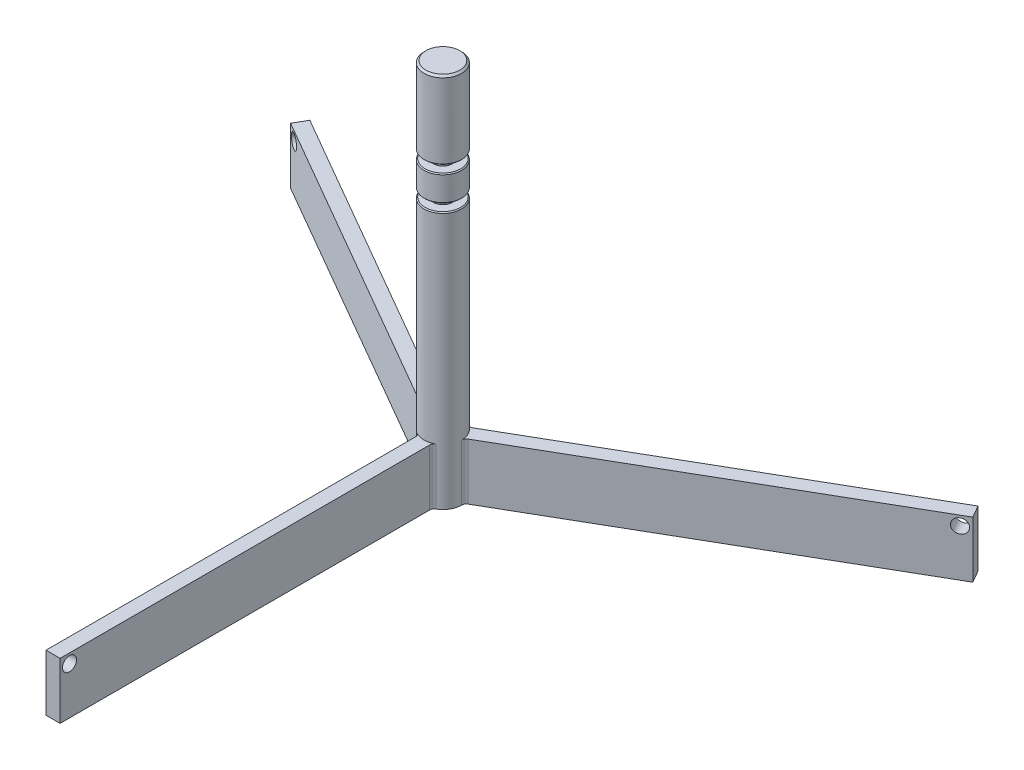
ISO-10303-21;
HEADER;
FILE_DESCRIPTION(('STEP AP214'),'2;1');
FILE_NAME('part.step','',(''),(''),'','','');
FILE_SCHEMA(('AUTOMOTIVE_DESIGN { 1 0 10303 214 1 1 1 1 }'));
ENDSEC;
DATA;
#1=APPLICATION_CONTEXT('core data for automotive mechanical design processes');
#2=APPLICATION_PROTOCOL_DEFINITION('international standard','automotive_design',2000,#1);
#3=PRODUCT_CONTEXT('',#1,'mechanical');
#4=PRODUCT('Part','Part','',(#3));
#5=PRODUCT_RELATED_PRODUCT_CATEGORY('part','',(#4));
#6=PRODUCT_DEFINITION_FORMATION('','',#4);
#7=PRODUCT_DEFINITION_CONTEXT('part definition',#1,'design');
#8=PRODUCT_DEFINITION('design','',#6,#7);
#9=PRODUCT_DEFINITION_SHAPE('','',#8);
#10=(LENGTH_UNIT() NAMED_UNIT(*) SI_UNIT(.MILLI.,.METRE.));
#11=(NAMED_UNIT(*) PLANE_ANGLE_UNIT() SI_UNIT($,.RADIAN.));
#12=(NAMED_UNIT(*) SI_UNIT($,.STERADIAN.) SOLID_ANGLE_UNIT());
#13=UNCERTAINTY_MEASURE_WITH_UNIT(LENGTH_MEASURE(1.E-05),#10,'distance_accuracy_value','');
#14=(GEOMETRIC_REPRESENTATION_CONTEXT(3) GLOBAL_UNCERTAINTY_ASSIGNED_CONTEXT((#13)) GLOBAL_UNIT_ASSIGNED_CONTEXT((#10,
#11,#12)) REPRESENTATION_CONTEXT('',''));
#15=CARTESIAN_POINT('',(0.,0.,0.));
#16=DIRECTION('',(0.,0.,1.));
#17=DIRECTION('',(1.,0.,0.));
#18=AXIS2_PLACEMENT_3D('',#15,#16,#17);
#19=CARTESIAN_POINT('',(0.,112.38552238806,0.));
#20=DIRECTION('',(0.,1.,0.));
#21=DIRECTION('',(0.,0.,1.));
#22=AXIS2_PLACEMENT_3D('',#19,#20,#21);
#23=CYLINDRICAL_SURFACE('',#22,12.7);
#24=CARTESIAN_POINT('',(0.,173.355,0.));
#25=DIRECTION('',(0.,-1.,0.));
#26=DIRECTION('',(0.,0.,-1.));
#27=AXIS2_PLACEMENT_3D('',#24,#25,#26);
#28=CIRCLE('',#27,12.7);
#29=CARTESIAN_POINT('',(0.,173.355,-12.7));
#30=VERTEX_POINT('',#29);
#31=EDGE_CURVE('E322',#30,#30,#28,.T.);
#32=ORIENTED_EDGE('',*,*,#31,.T.);
#33=EDGE_LOOP('',(#32));
#34=FACE_BOUND('',#33,.T.);
#35=CARTESIAN_POINT('',(0.,38.1,0.));
#36=DIRECTION('',(0.,-1.,0.));
#37=DIRECTION('',(0.,0.,-1.));
#38=AXIS2_PLACEMENT_3D('',#35,#36,#37);
#39=CIRCLE('',#38,12.7);
#40=CARTESIAN_POINT('',(6.35000000000009,38.1,-10.9985226280623));
#41=VERTEX_POINT('',#40);
#42=CARTESIAN_POINT('',(12.7,38.1,1.17961196366423E-13));
#43=VERTEX_POINT('',#42);
#44=EDGE_CURVE('E279',#41,#43,#39,.T.);
#45=ORIENTED_EDGE('',*,*,#44,.F.);
#46=DIRECTION('',(0.,1.,0.));
#47=VECTOR('',#46,1.);
#48=CARTESIAN_POINT('',(6.35000000000009,112.38552238806,-10.9985226280623));
#49=LINE('',#48,#47);
#50=CARTESIAN_POINT('',(6.35000000000009,0.,-10.9985226280623));
#51=VERTEX_POINT('',#50);
#52=EDGE_CURVE('E309',#41,#51,#49,.F.);
#53=ORIENTED_EDGE('',*,*,#52,.T.);
#54=CARTESIAN_POINT('',(0.,0.,0.));
#55=DIRECTION('',(0.,1.,0.));
#56=DIRECTION('',(0.,0.,1.));
#57=AXIS2_PLACEMENT_3D('',#54,#55,#56);
#58=CIRCLE('',#57,12.7);
#59=CARTESIAN_POINT('',(-6.34999999999994,0.,-10.9985226280624));
#60=VERTEX_POINT('',#59);
#61=EDGE_CURVE('E244',#51,#60,#58,.T.);
#62=ORIENTED_EDGE('',*,*,#61,.T.);
#63=DIRECTION('',(0.,1.,0.));
#64=VECTOR('',#63,1.);
#65=CARTESIAN_POINT('',(-6.34999999999994,112.38552238806,-10.9985226280624));
#66=LINE('',#65,#64);
#67=CARTESIAN_POINT('',(-6.34999999999994,38.1,-10.9985226280624));
#68=VERTEX_POINT('',#67);
#69=EDGE_CURVE('E285',#60,#68,#66,.T.);
#70=ORIENTED_EDGE('',*,*,#69,.T.);
#71=CARTESIAN_POINT('',(-12.7,38.1,0.));
#72=VERTEX_POINT('',#71);
#73=EDGE_CURVE('E281',#72,#68,#39,.T.);
#74=ORIENTED_EDGE('',*,*,#73,.F.);
#75=DIRECTION('',(0.,1.,0.));
#76=VECTOR('',#75,1.);
#77=CARTESIAN_POINT('',(-12.7,112.38552238806,0.));
#78=LINE('',#77,#76);
#79=CARTESIAN_POINT('',(-12.7,0.,0.));
#80=VERTEX_POINT('',#79);
#81=EDGE_CURVE('E288',#72,#80,#78,.F.);
#82=ORIENTED_EDGE('',*,*,#81,.T.);
#83=CARTESIAN_POINT('',(-6.35,0.,10.9985226280624));
#84=VERTEX_POINT('',#83);
#85=EDGE_CURVE('E239',#80,#84,#58,.T.);
#86=ORIENTED_EDGE('',*,*,#85,.T.);
#87=DIRECTION('',(0.,1.,0.));
#88=VECTOR('',#87,1.);
#89=CARTESIAN_POINT('',(-6.35,112.38552238806,10.9985226280624));
#90=LINE('',#89,#88);
#91=CARTESIAN_POINT('',(-6.35,38.1,10.9985226280624));
#92=VERTEX_POINT('',#91);
#93=EDGE_CURVE('E261',#84,#92,#90,.T.);
#94=ORIENTED_EDGE('',*,*,#93,.T.);
#95=CARTESIAN_POINT('',(0.,38.1,0.));
#96=DIRECTION('',(0.,-1.,0.));
#97=DIRECTION('',(0.,0.,-1.));
#98=AXIS2_PLACEMENT_3D('',#95,#96,#97);
#99=CIRCLE('',#98,12.7);
#100=CARTESIAN_POINT('',(6.35,38.1,10.9985226280624));
#101=VERTEX_POINT('',#100);
#102=EDGE_CURVE('E256',#101,#92,#99,.T.);
#103=ORIENTED_EDGE('',*,*,#102,.F.);
#104=DIRECTION('',(0.,1.,0.));
#105=VECTOR('',#104,1.);
#106=CARTESIAN_POINT('',(6.35,112.38552238806,10.9985226280624));
#107=LINE('',#106,#105);
#108=CARTESIAN_POINT('',(6.35,0.,10.9985226280624));
#109=VERTEX_POINT('',#108);
#110=EDGE_CURVE('E264',#101,#109,#107,.F.);
#111=ORIENTED_EDGE('',*,*,#110,.T.);
#112=CARTESIAN_POINT('',(12.7,0.,1.17961196366423E-13));
#113=VERTEX_POINT('',#112);
#114=EDGE_CURVE('E240',#109,#113,#58,.T.);
#115=ORIENTED_EDGE('',*,*,#114,.T.);
#116=DIRECTION('',(0.,1.,0.));
#117=VECTOR('',#116,1.);
#118=CARTESIAN_POINT('',(12.7,112.38552238806,1.17961196366423E-13));
#119=LINE('',#118,#117);
#120=EDGE_CURVE('E306',#113,#43,#119,.T.);
#121=ORIENTED_EDGE('',*,*,#120,.T.);
#122=EDGE_LOOP('',(#45,#53,#62,#70,#74,#82,#86,#94,#103,#111,#115,#121));
#123=FACE_BOUND('',#122,.T.);
#124=ADVANCED_FACE('F37',(#34,#123),#23,.T.);
#125=CARTESIAN_POINT('',(0.,254.,0.));
#126=DIRECTION('',(0.,-1.,0.));
#127=DIRECTION('',(0.,0.,-1.));
#128=AXIS2_PLACEMENT_3D('',#125,#126,#127);
#129=PLANE('',#128);
#130=CARTESIAN_POINT('',(0.,254.,0.));
#131=DIRECTION('',(0.,-1.,0.));
#132=DIRECTION('',(0.,0.,-1.));
#133=AXIS2_PLACEMENT_3D('',#130,#131,#132);
#134=CIRCLE('',#133,11.43);
#135=CARTESIAN_POINT('',(0.,254.,-11.43));
#136=VERTEX_POINT('',#135);
#137=EDGE_CURVE('E45',#136,#136,#134,.F.);
#138=ORIENTED_EDGE('',*,*,#137,.T.);
#139=EDGE_LOOP('',(#138));
#140=FACE_BOUND('',#139,.T.);
#141=ADVANCED_FACE('F345',(#140),#129,.F.);
#142=CARTESIAN_POINT('',(0.,112.38552238806,0.));
#143=DIRECTION('',(0.,1.,0.));
#144=DIRECTION('',(0.,0.,1.));
#145=AXIS2_PLACEMENT_3D('',#142,#143,#144);
#146=CYLINDRICAL_SURFACE('',#145,12.7);
#147=CARTESIAN_POINT('',(0.,252.73,0.));
#148=DIRECTION('',(0.,-1.,0.));
#149=DIRECTION('',(0.,0.,-1.));
#150=AXIS2_PLACEMENT_3D('',#147,#148,#149);
#151=CIRCLE('',#150,12.7);
#152=CARTESIAN_POINT('',(0.,252.73,-12.7));
#153=VERTEX_POINT('',#152);
#154=EDGE_CURVE('E11',#153,#153,#151,.T.);
#155=ORIENTED_EDGE('',*,*,#154,.T.);
#156=EDGE_LOOP('',(#155));
#157=FACE_BOUND('',#156,.T.);
#158=CARTESIAN_POINT('',(0.,202.311,0.));
#159=DIRECTION('',(0.,1.,0.));
#160=DIRECTION('',(0.,0.,1.));
#161=AXIS2_PLACEMENT_3D('',#158,#159,#160);
#162=CIRCLE('',#161,12.7);
#163=CARTESIAN_POINT('',(0.,202.311,12.7));
#164=VERTEX_POINT('',#163);
#165=EDGE_CURVE('E337',#164,#164,#162,.T.);
#166=ORIENTED_EDGE('',*,*,#165,.T.);
#167=EDGE_LOOP('',(#166));
#168=FACE_BOUND('',#167,.T.);
#169=ADVANCED_FACE('F362',(#157,#168),#146,.T.);
#170=CARTESIAN_POINT('',(6.35,201.676,0.));
#171=DIRECTION('',(0.,1.,0.));
#172=DIRECTION('',(0.,0.,1.));
#173=AXIS2_PLACEMENT_3D('',#170,#171,#172);
#174=PLANE('',#173);
#175=CARTESIAN_POINT('',(0.,201.676,0.));
#176=DIRECTION('',(0.,1.,0.));
#177=DIRECTION('',(0.,0.,1.));
#178=AXIS2_PLACEMENT_3D('',#175,#176,#177);
#179=CIRCLE('',#178,12.065);
#180=CARTESIAN_POINT('',(0.,201.676,12.065));
#181=VERTEX_POINT('',#180);
#182=EDGE_CURVE('E340',#181,#181,#179,.F.);
#183=ORIENTED_EDGE('',*,*,#182,.T.);
#184=EDGE_LOOP('',(#183));
#185=FACE_BOUND('',#184,.T.);
#186=CARTESIAN_POINT('',(0.,201.676,0.));
#187=DIRECTION('',(0.,1.,0.));
#188=DIRECTION('',(0.,0.,1.));
#189=AXIS2_PLACEMENT_3D('',#186,#187,#188);
#190=CIRCLE('',#189,6.35);
#191=CARTESIAN_POINT('',(0.,201.676,6.35));
#192=VERTEX_POINT('',#191);
#193=EDGE_CURVE('E253',#192,#192,#190,.T.);
#194=ORIENTED_EDGE('',*,*,#193,.T.);
#195=EDGE_LOOP('',(#194));
#196=FACE_BOUND('',#195,.T.);
#197=ADVANCED_FACE('F391',(#185,#196),#174,.F.);
#198=CARTESIAN_POINT('',(0.,112.38552238806,0.));
#199=DIRECTION('',(0.,1.,0.));
#200=DIRECTION('',(0.,0.,1.));
#201=AXIS2_PLACEMENT_3D('',#198,#199,#200);
#202=CYLINDRICAL_SURFACE('',#201,6.35);
#203=ORIENTED_EDGE('',*,*,#193,.F.);
#204=EDGE_LOOP('',(#203));
#205=FACE_BOUND('',#204,.T.);
#206=CARTESIAN_POINT('',(0.,196.596,0.));
#207=DIRECTION('',(0.,1.,0.));
#208=DIRECTION('',(0.,0.,1.));
#209=AXIS2_PLACEMENT_3D('',#206,#207,#208);
#210=CIRCLE('',#209,6.35);
#211=CARTESIAN_POINT('',(0.,196.596,6.35));
#212=VERTEX_POINT('',#211);
#213=EDGE_CURVE('E250',#212,#212,#210,.T.);
#214=ORIENTED_EDGE('',*,*,#213,.T.);
#215=EDGE_LOOP('',(#214));
#216=FACE_BOUND('',#215,.T.);
#217=ADVANCED_FACE('F387',(#205,#216),#202,.T.);
#218=CARTESIAN_POINT('',(12.7,196.596,0.));
#219=DIRECTION('',(0.,-1.,0.));
#220=DIRECTION('',(0.,0.,-1.));
#221=AXIS2_PLACEMENT_3D('',#218,#219,#220);
#222=PLANE('',#221);
#223=CARTESIAN_POINT('',(0.,196.596,0.));
#224=DIRECTION('',(0.,-1.,0.));
#225=DIRECTION('',(0.,0.,-1.));
#226=AXIS2_PLACEMENT_3D('',#223,#224,#225);
#227=CIRCLE('',#226,12.065);
#228=CARTESIAN_POINT('',(0.,196.596,-12.065));
#229=VERTEX_POINT('',#228);
#230=EDGE_CURVE('E334',#229,#229,#227,.F.);
#231=ORIENTED_EDGE('',*,*,#230,.T.);
#232=EDGE_LOOP('',(#231));
#233=FACE_BOUND('',#232,.T.);
#234=ORIENTED_EDGE('',*,*,#213,.F.);
#235=EDGE_LOOP('',(#234));
#236=FACE_BOUND('',#235,.T.);
#237=ADVANCED_FACE('F383',(#233,#236),#222,.F.);
#238=CARTESIAN_POINT('',(0.,112.38552238806,0.));
#239=DIRECTION('',(0.,1.,0.));
#240=DIRECTION('',(0.,0.,1.));
#241=AXIS2_PLACEMENT_3D('',#238,#239,#240);
#242=CYLINDRICAL_SURFACE('',#241,12.7);
#243=CARTESIAN_POINT('',(0.,179.705,0.));
#244=DIRECTION('',(0.,1.,0.));
#245=DIRECTION('',(0.,0.,1.));
#246=AXIS2_PLACEMENT_3D('',#243,#244,#245);
#247=CIRCLE('',#246,12.7);
#248=CARTESIAN_POINT('',(0.,179.705,12.7));
#249=VERTEX_POINT('',#248);
#250=EDGE_CURVE('E328',#249,#249,#247,.T.);
#251=ORIENTED_EDGE('',*,*,#250,.T.);
#252=EDGE_LOOP('',(#251));
#253=FACE_BOUND('',#252,.T.);
#254=CARTESIAN_POINT('',(0.,195.961,0.));
#255=DIRECTION('',(0.,-1.,0.));
#256=DIRECTION('',(0.,0.,-1.));
#257=AXIS2_PLACEMENT_3D('',#254,#255,#256);
#258=CIRCLE('',#257,12.7);
#259=CARTESIAN_POINT('',(0.,195.961,-12.7));
#260=VERTEX_POINT('',#259);
#261=EDGE_CURVE('E325',#260,#260,#258,.T.);
#262=ORIENTED_EDGE('',*,*,#261,.T.);
#263=EDGE_LOOP('',(#262));
#264=FACE_BOUND('',#263,.T.);
#265=ADVANCED_FACE('F379',(#253,#264),#242,.T.);
#266=CARTESIAN_POINT('',(6.35,179.07,0.));
#267=DIRECTION('',(0.,1.,0.));
#268=DIRECTION('',(0.,0.,1.));
#269=AXIS2_PLACEMENT_3D('',#266,#267,#268);
#270=PLANE('',#269);
#271=CARTESIAN_POINT('',(0.,179.07,0.));
#272=DIRECTION('',(0.,1.,0.));
#273=DIRECTION('',(0.,0.,1.));
#274=AXIS2_PLACEMENT_3D('',#271,#272,#273);
#275=CIRCLE('',#274,12.065);
#276=CARTESIAN_POINT('',(0.,179.07,12.065));
#277=VERTEX_POINT('',#276);
#278=EDGE_CURVE('E331',#277,#277,#275,.F.);
#279=ORIENTED_EDGE('',*,*,#278,.T.);
#280=EDGE_LOOP('',(#279));
#281=FACE_BOUND('',#280,.T.);
#282=CARTESIAN_POINT('',(0.,179.07,0.));
#283=DIRECTION('',(0.,1.,0.));
#284=DIRECTION('',(0.,0.,1.));
#285=AXIS2_PLACEMENT_3D('',#282,#283,#284);
#286=CIRCLE('',#285,6.35);
#287=CARTESIAN_POINT('',(0.,179.07,6.35));
#288=VERTEX_POINT('',#287);
#289=EDGE_CURVE('E247',#288,#288,#286,.T.);
#290=ORIENTED_EDGE('',*,*,#289,.T.);
#291=EDGE_LOOP('',(#290));
#292=FACE_BOUND('',#291,.T.);
#293=ADVANCED_FACE('F375',(#281,#292),#270,.F.);
#294=CARTESIAN_POINT('',(0.,112.38552238806,0.));
#295=DIRECTION('',(0.,1.,0.));
#296=DIRECTION('',(0.,0.,1.));
#297=AXIS2_PLACEMENT_3D('',#294,#295,#296);
#298=CYLINDRICAL_SURFACE('',#297,6.35);
#299=ORIENTED_EDGE('',*,*,#289,.F.);
#300=EDGE_LOOP('',(#299));
#301=FACE_BOUND('',#300,.T.);
#302=CARTESIAN_POINT('',(0.,173.99,0.));
#303=DIRECTION('',(0.,1.,0.));
#304=DIRECTION('',(0.,0.,1.));
#305=AXIS2_PLACEMENT_3D('',#302,#303,#304);
#306=CIRCLE('',#305,6.35);
#307=CARTESIAN_POINT('',(0.,173.99,6.35));
#308=VERTEX_POINT('',#307);
#309=EDGE_CURVE('E243',#308,#308,#306,.T.);
#310=ORIENTED_EDGE('',*,*,#309,.T.);
#311=EDGE_LOOP('',(#310));
#312=FACE_BOUND('',#311,.T.);
#313=ADVANCED_FACE('F371',(#301,#312),#298,.T.);
#314=CARTESIAN_POINT('',(12.7,173.99,0.));
#315=DIRECTION('',(0.,-1.,0.));
#316=DIRECTION('',(0.,0.,-1.));
#317=AXIS2_PLACEMENT_3D('',#314,#315,#316);
#318=PLANE('',#317);
#319=CARTESIAN_POINT('',(0.,173.99,0.));
#320=DIRECTION('',(0.,-1.,0.));
#321=DIRECTION('',(0.,0.,-1.));
#322=AXIS2_PLACEMENT_3D('',#319,#320,#321);
#323=CIRCLE('',#322,12.065);
#324=CARTESIAN_POINT('',(0.,173.99,-12.065));
#325=VERTEX_POINT('',#324);
#326=EDGE_CURVE('E319',#325,#325,#323,.F.);
#327=ORIENTED_EDGE('',*,*,#326,.T.);
#328=EDGE_LOOP('',(#327));
#329=FACE_BOUND('',#328,.T.);
#330=ORIENTED_EDGE('',*,*,#309,.F.);
#331=EDGE_LOOP('',(#330));
#332=FACE_BOUND('',#331,.T.);
#333=ADVANCED_FACE('F368',(#329,#332),#318,.F.);
#334=CARTESIAN_POINT('',(0.,0.,0.));
#335=DIRECTION('',(0.,1.,0.));
#336=DIRECTION('',(0.,0.,1.));
#337=AXIS2_PLACEMENT_3D('',#334,#335,#336);
#338=PLANE('',#337);
#339=ORIENTED_EDGE('',*,*,#85,.F.);
#340=CARTESIAN_POINT('',(-15.875,0.,0.));
#341=DIRECTION('',(0.,1.,0.));
#342=DIRECTION('',(0.,0.,1.));
#343=AXIS2_PLACEMENT_3D('',#340,#341,#342);
#344=CIRCLE('',#343,3.175);
#345=CARTESIAN_POINT('',(-14.2875,0.,-2.74963065701563));
#346=VERTEX_POINT('',#345);
#347=EDGE_CURVE('E296',#80,#346,#344,.T.);
#348=ORIENTED_EDGE('',*,*,#347,.T.);
#349=DIRECTION('',(0.866025403784436,0.,0.500000000000004));
#350=VECTOR('',#349,1.);
#351=CARTESIAN_POINT('',(-230.600594532294,0.,-127.638054014478));
#352=LINE('',#351,#350);
#353=CARTESIAN_POINT('',(-230.600594532294,0.,-127.638054014478));
#354=VERTEX_POINT('',#353);
#355=EDGE_CURVE('E206',#354,#346,#352,.T.);
#356=ORIENTED_EDGE('',*,*,#355,.F.);
#357=DIRECTION('',(-0.500000000000004,0.,0.866025403784436));
#358=VECTOR('',#357,1.);
#359=CARTESIAN_POINT('',(-225.838094532294,0.,-135.886945985524));
#360=LINE('',#359,#358);
#361=CARTESIAN_POINT('',(-225.838094532294,0.,-135.886945985524));
#362=VERTEX_POINT('',#361);
#363=EDGE_CURVE('E189',#362,#354,#360,.T.);
#364=ORIENTED_EDGE('',*,*,#363,.F.);
#365=DIRECTION('',(0.866025403784436,0.,0.500000000000004));
#366=VECTOR('',#365,1.);
#367=CARTESIAN_POINT('',(-225.838094532294,0.,-135.886945985524));
#368=LINE('',#367,#366);
#369=CARTESIAN_POINT('',(-9.5249999999999,0.,-10.9985226280624));
#370=VERTEX_POINT('',#369);
#371=EDGE_CURVE('E209',#362,#370,#368,.T.);
#372=ORIENTED_EDGE('',*,*,#371,.T.);
#373=CARTESIAN_POINT('',(-7.93749999999992,0.,-13.748153285078));
#374=DIRECTION('',(0.,1.,0.));
#375=DIRECTION('',(0.,0.,1.));
#376=AXIS2_PLACEMENT_3D('',#373,#374,#375);
#377=CIRCLE('',#376,3.175);
#378=EDGE_CURVE('E298',#370,#60,#377,.T.);
#379=ORIENTED_EDGE('',*,*,#378,.T.);
#380=ORIENTED_EDGE('',*,*,#61,.F.);
#381=CARTESIAN_POINT('',(7.93750000000011,0.,-13.7481532850779));
#382=DIRECTION('',(0.,1.,0.));
#383=DIRECTION('',(0.,0.,1.));
#384=AXIS2_PLACEMENT_3D('',#381,#382,#383);
#385=CIRCLE('',#384,3.175);
#386=CARTESIAN_POINT('',(9.52500000000009,0.,-10.9985226280623));
#387=VERTEX_POINT('',#386);
#388=EDGE_CURVE('E315',#51,#387,#385,.T.);
#389=ORIENTED_EDGE('',*,*,#388,.T.);
#390=DIRECTION('',(-0.866025403784443,0.,0.499999999999992));
#391=VECTOR('',#390,1.);
#392=CARTESIAN_POINT('',(225.838094532295,0.,-135.886945985521));
#393=LINE('',#392,#391);
#394=CARTESIAN_POINT('',(225.838094532295,0.,-135.886945985521));
#395=VERTEX_POINT('',#394);
#396=EDGE_CURVE('E171',#395,#387,#393,.T.);
#397=ORIENTED_EDGE('',*,*,#396,.F.);
#398=DIRECTION('',(-0.499999999999992,0.,-0.866025403784443));
#399=VECTOR('',#398,1.);
#400=CARTESIAN_POINT('',(230.600594532295,0.,-127.638054014474));
#401=LINE('',#400,#399);
#402=CARTESIAN_POINT('',(230.600594532295,0.,-127.638054014474));
#403=VERTEX_POINT('',#402);
#404=EDGE_CURVE('E164',#403,#395,#401,.T.);
#405=ORIENTED_EDGE('',*,*,#404,.F.);
#406=DIRECTION('',(-0.866025403784443,0.,0.499999999999992));
#407=VECTOR('',#406,1.);
#408=CARTESIAN_POINT('',(230.600594532295,0.,-127.638054014474));
#409=LINE('',#408,#407);
#410=CARTESIAN_POINT('',(14.2875,0.,-2.74963065701544));
#411=VERTEX_POINT('',#410);
#412=EDGE_CURVE('E169',#403,#411,#409,.T.);
#413=ORIENTED_EDGE('',*,*,#412,.T.);
#414=CARTESIAN_POINT('',(15.875,0.,1.47451495458029E-13));
#415=DIRECTION('',(0.,1.,0.));
#416=DIRECTION('',(0.,0.,1.));
#417=AXIS2_PLACEMENT_3D('',#414,#415,#416);
#418=CIRCLE('',#417,3.175);
#419=EDGE_CURVE('E52',#411,#113,#418,.T.);
#420=ORIENTED_EDGE('',*,*,#419,.T.);
#421=ORIENTED_EDGE('',*,*,#114,.F.);
#422=CARTESIAN_POINT('',(7.9375,0.,13.748153285078));
#423=DIRECTION('',(0.,1.,0.));
#424=DIRECTION('',(0.,0.,1.));
#425=AXIS2_PLACEMENT_3D('',#422,#423,#424);
#426=CIRCLE('',#425,3.175);
#427=CARTESIAN_POINT('',(4.7625,0.,13.748153285078));
#428=VERTEX_POINT('',#427);
#429=EDGE_CURVE('E272',#109,#428,#426,.T.);
#430=ORIENTED_EDGE('',*,*,#429,.T.);
#431=DIRECTION('',(0.,0.,-1.));
#432=VECTOR('',#431,1.);
#433=CARTESIAN_POINT('',(4.7625,0.,263.525));
#434=LINE('',#433,#432);
#435=CARTESIAN_POINT('',(4.7625,0.,263.525));
#436=VERTEX_POINT('',#435);
#437=EDGE_CURVE('E233',#436,#428,#434,.T.);
#438=ORIENTED_EDGE('',*,*,#437,.F.);
#439=DIRECTION('',(1.,0.,0.));
#440=VECTOR('',#439,1.);
#441=CARTESIAN_POINT('',(-4.7625,0.,263.525));
#442=LINE('',#441,#440);
#443=CARTESIAN_POINT('',(-4.7625,0.,263.525));
#444=VERTEX_POINT('',#443);
#445=EDGE_CURVE('E221',#444,#436,#442,.T.);
#446=ORIENTED_EDGE('',*,*,#445,.F.);
#447=DIRECTION('',(0.,0.,-1.));
#448=VECTOR('',#447,1.);
#449=CARTESIAN_POINT('',(-4.7625,0.,263.525));
#450=LINE('',#449,#448);
#451=CARTESIAN_POINT('',(-4.7625,0.,13.748153285078));
#452=VERTEX_POINT('',#451);
#453=EDGE_CURVE('E236',#444,#452,#450,.T.);
#454=ORIENTED_EDGE('',*,*,#453,.T.);
#455=CARTESIAN_POINT('',(-7.9375,0.,13.748153285078));
#456=DIRECTION('',(0.,1.,0.));
#457=DIRECTION('',(0.,0.,1.));
#458=AXIS2_PLACEMENT_3D('',#455,#456,#457);
#459=CIRCLE('',#458,3.175);
#460=EDGE_CURVE('E274',#452,#84,#459,.T.);
#461=ORIENTED_EDGE('',*,*,#460,.T.);
#462=EDGE_LOOP('',(#339,#348,#356,#364,#372,#379,#380,#389,#397,#405,#413,#420,#421,#430,#438,
#446,#454,#461));
#463=FACE_BOUND('',#462,.T.);
#464=ADVANCED_FACE('F167',(#463),#338,.F.);
#465=CARTESIAN_POINT('',(-4.7625,0.,263.525));
#466=DIRECTION('',(1.,0.,0.));
#467=DIRECTION('',(0.,1.,0.));
#468=AXIS2_PLACEMENT_3D('',#465,#466,#467);
#469=PLANE('',#468);
#470=CARTESIAN_POINT('',(-4.7625,31.75,257.175));
#471=DIRECTION('',(1.,0.,0.));
#472=DIRECTION('',(0.,1.,0.));
#473=AXIS2_PLACEMENT_3D('',#470,#471,#472);
#474=CIRCLE('',#473,4.76250000000001);
#475=CARTESIAN_POINT('',(-4.7625,36.5125,257.175));
#476=VERTEX_POINT('',#475);
#477=EDGE_CURVE('E215',#476,#476,#474,.T.);
#478=ORIENTED_EDGE('',*,*,#477,.T.);
#479=EDGE_LOOP('',(#478));
#480=FACE_BOUND('',#479,.T.);
#481=DIRECTION('',(0.,0.,-1.));
#482=VECTOR('',#481,1.);
#483=CARTESIAN_POINT('',(-4.7625,38.1,263.525));
#484=LINE('',#483,#482);
#485=CARTESIAN_POINT('',(-4.7625,38.1,263.525));
#486=VERTEX_POINT('',#485);
#487=CARTESIAN_POINT('',(-4.7625,38.1,13.748153285078));
#488=VERTEX_POINT('',#487);
#489=EDGE_CURVE('E227',#486,#488,#484,.T.);
#490=ORIENTED_EDGE('',*,*,#489,.T.);
#491=DIRECTION('',(0.,-1.,0.));
#492=VECTOR('',#491,1.);
#493=CARTESIAN_POINT('',(-4.7625,0.,13.748153285078));
#494=LINE('',#493,#492);
#495=EDGE_CURVE('E266',#488,#452,#494,.T.);
#496=ORIENTED_EDGE('',*,*,#495,.T.);
#497=ORIENTED_EDGE('',*,*,#453,.F.);
#498=DIRECTION('',(0.,-1.,0.));
#499=VECTOR('',#498,1.);
#500=CARTESIAN_POINT('',(-4.7625,0.,263.525));
#501=LINE('',#500,#499);
#502=EDGE_CURVE('E218',#486,#444,#501,.T.);
#503=ORIENTED_EDGE('',*,*,#502,.F.);
#504=EDGE_LOOP('',(#490,#496,#497,#503));
#505=FACE_BOUND('',#504,.T.);
#506=ADVANCED_FACE('F665',(#480,#505),#469,.F.);
#507=CARTESIAN_POINT('',(4.7625,0.,263.525));
#508=DIRECTION('',(-1.,0.,0.));
#509=DIRECTION('',(0.,-1.,0.));
#510=AXIS2_PLACEMENT_3D('',#507,#508,#509);
#511=PLANE('',#510);
#512=CARTESIAN_POINT('',(4.7625,31.75,257.175));
#513=DIRECTION('',(1.,0.,0.));
#514=DIRECTION('',(0.,1.,0.));
#515=AXIS2_PLACEMENT_3D('',#512,#513,#514);
#516=CIRCLE('',#515,4.76250000000001);
#517=CARTESIAN_POINT('',(4.7625,36.5125,257.175));
#518=VERTEX_POINT('',#517);
#519=EDGE_CURVE('E212',#518,#518,#516,.T.);
#520=ORIENTED_EDGE('',*,*,#519,.F.);
#521=EDGE_LOOP('',(#520));
#522=FACE_BOUND('',#521,.T.);
#523=ORIENTED_EDGE('',*,*,#437,.T.);
#524=DIRECTION('',(0.,-1.,0.));
#525=VECTOR('',#524,1.);
#526=CARTESIAN_POINT('',(4.7625,38.1,13.748153285078));
#527=LINE('',#526,#525);
#528=CARTESIAN_POINT('',(4.7625,38.1,13.748153285078));
#529=VERTEX_POINT('',#528);
#530=EDGE_CURVE('E258',#428,#529,#527,.F.);
#531=ORIENTED_EDGE('',*,*,#530,.T.);
#532=DIRECTION('',(0.,0.,-1.));
#533=VECTOR('',#532,1.);
#534=CARTESIAN_POINT('',(4.7625,38.1,263.525));
#535=LINE('',#534,#533);
#536=CARTESIAN_POINT('',(4.7625,38.1,263.525));
#537=VERTEX_POINT('',#536);
#538=EDGE_CURVE('E230',#537,#529,#535,.T.);
#539=ORIENTED_EDGE('',*,*,#538,.F.);
#540=DIRECTION('',(0.,1.,0.));
#541=VECTOR('',#540,1.);
#542=CARTESIAN_POINT('',(4.7625,0.,263.525));
#543=LINE('',#542,#541);
#544=EDGE_CURVE('E223',#436,#537,#543,.T.);
#545=ORIENTED_EDGE('',*,*,#544,.F.);
#546=EDGE_LOOP('',(#523,#531,#539,#545));
#547=FACE_BOUND('',#546,.T.);
#548=ADVANCED_FACE('F655',(#522,#547),#511,.F.);
#549=CARTESIAN_POINT('',(-4.7625,38.1,263.525));
#550=DIRECTION('',(0.,-1.,0.));
#551=DIRECTION('',(0.,0.,-1.));
#552=AXIS2_PLACEMENT_3D('',#549,#550,#551);
#553=PLANE('',#552);
#554=ORIENTED_EDGE('',*,*,#538,.T.);
#555=CARTESIAN_POINT('',(7.9375,38.1,13.748153285078));
#556=DIRECTION('',(0.,-1.,0.));
#557=DIRECTION('',(0.,0.,-1.));
#558=AXIS2_PLACEMENT_3D('',#555,#556,#557);
#559=CIRCLE('',#558,3.175);
#560=EDGE_CURVE('E269',#529,#101,#559,.T.);
#561=ORIENTED_EDGE('',*,*,#560,.T.);
#562=ORIENTED_EDGE('',*,*,#102,.T.);
#563=CARTESIAN_POINT('',(-7.9375,38.1,13.748153285078));
#564=DIRECTION('',(0.,-1.,0.));
#565=DIRECTION('',(0.,0.,-1.));
#566=AXIS2_PLACEMENT_3D('',#563,#564,#565);
#567=CIRCLE('',#566,3.175);
#568=EDGE_CURVE('E277',#92,#488,#567,.T.);
#569=ORIENTED_EDGE('',*,*,#568,.T.);
#570=ORIENTED_EDGE('',*,*,#489,.F.);
#571=DIRECTION('',(-1.,0.,0.));
#572=VECTOR('',#571,1.);
#573=CARTESIAN_POINT('',(-4.7625,38.1,263.525));
#574=LINE('',#573,#572);
#575=EDGE_CURVE('E225',#537,#486,#574,.T.);
#576=ORIENTED_EDGE('',*,*,#575,.F.);
#577=EDGE_LOOP('',(#554,#561,#562,#569,#570,#576));
#578=FACE_BOUND('',#577,.T.);
#579=ADVANCED_FACE('F645',(#578),#553,.F.);
#580=CARTESIAN_POINT('',(-4.7625,38.1,263.525));
#581=DIRECTION('',(0.,0.,-1.));
#582=DIRECTION('',(-1.,0.,0.));
#583=AXIS2_PLACEMENT_3D('',#580,#581,#582);
#584=PLANE('',#583);
#585=ORIENTED_EDGE('',*,*,#502,.T.);
#586=ORIENTED_EDGE('',*,*,#445,.T.);
#587=ORIENTED_EDGE('',*,*,#544,.T.);
#588=ORIENTED_EDGE('',*,*,#575,.T.);
#589=EDGE_LOOP('',(#585,#586,#587,#588));
#590=FACE_BOUND('',#589,.T.);
#591=ADVANCED_FACE('F635',(#590),#584,.F.);
#592=CARTESIAN_POINT('',(-12.7,31.75,257.175));
#593=DIRECTION('',(1.,0.,0.));
#594=DIRECTION('',(0.,1.,0.));
#595=AXIS2_PLACEMENT_3D('',#592,#593,#594);
#596=CYLINDRICAL_SURFACE('',#595,4.76250000000001);
#597=ORIENTED_EDGE('',*,*,#519,.T.);
#598=EDGE_LOOP('',(#597));
#599=FACE_BOUND('',#598,.T.);
#600=ORIENTED_EDGE('',*,*,#477,.F.);
#601=EDGE_LOOP('',(#600));
#602=FACE_BOUND('',#601,.T.);
#603=ADVANCED_FACE('F403',(#599,#602),#596,.F.);
#604=CARTESIAN_POINT('',(7.9375,112.38552238806,13.748153285078));
#605=DIRECTION('',(0.,1.,0.));
#606=DIRECTION('',(0.,0.,1.));
#607=AXIS2_PLACEMENT_3D('',#604,#605,#606);
#608=CYLINDRICAL_SURFACE('',#607,3.175);
#609=ORIENTED_EDGE('',*,*,#429,.F.);
#610=ORIENTED_EDGE('',*,*,#110,.F.);
#611=ORIENTED_EDGE('',*,*,#560,.F.);
#612=ORIENTED_EDGE('',*,*,#530,.F.);
#613=EDGE_LOOP('',(#609,#610,#611,#612));
#614=FACE_BOUND('',#613,.T.);
#615=ADVANCED_FACE('F399',(#614),#608,.F.);
#616=CARTESIAN_POINT('',(-7.9375,112.38552238806,13.748153285078));
#617=DIRECTION('',(0.,1.,0.));
#618=DIRECTION('',(0.,0.,1.));
#619=AXIS2_PLACEMENT_3D('',#616,#617,#618);
#620=CYLINDRICAL_SURFACE('',#619,3.175);
#621=ORIENTED_EDGE('',*,*,#568,.F.);
#622=ORIENTED_EDGE('',*,*,#93,.F.);
#623=ORIENTED_EDGE('',*,*,#460,.F.);
#624=ORIENTED_EDGE('',*,*,#495,.F.);
#625=EDGE_LOOP('',(#621,#622,#623,#624));
#626=FACE_BOUND('',#625,.T.);
#627=ADVANCED_FACE('F402',(#626),#620,.F.);
#628=CARTESIAN_POINT('',(230.600594532295,38.1,-127.638054014474));
#629=DIRECTION('',(-0.866025403784443,0.,0.499999999999992));
#630=DIRECTION('',(0.499999999999992,0.,0.866025403784443));
#631=AXIS2_PLACEMENT_3D('',#628,#629,#630);
#632=PLANE('',#631);
#633=DIRECTION('',(0.,-1.,0.));
#634=VECTOR('',#633,1.);
#635=CARTESIAN_POINT('',(230.600594532295,0.,-127.638054014474));
#636=LINE('',#635,#634);
#637=CARTESIAN_POINT('',(230.600594532295,38.1,-127.638054014474));
#638=VERTEX_POINT('',#637);
#639=EDGE_CURVE('E175',#638,#403,#636,.T.);
#640=ORIENTED_EDGE('',*,*,#639,.T.);
#641=ORIENTED_EDGE('',*,*,#404,.T.);
#642=DIRECTION('',(0.,1.,0.));
#643=VECTOR('',#642,1.);
#644=CARTESIAN_POINT('',(225.838094532295,0.,-135.886945985521));
#645=LINE('',#644,#643);
#646=CARTESIAN_POINT('',(225.838094532295,38.1,-135.886945985521));
#647=VERTEX_POINT('',#646);
#648=EDGE_CURVE('E174',#395,#647,#645,.T.);
#649=ORIENTED_EDGE('',*,*,#648,.T.);
#650=DIRECTION('',(0.499999999999992,0.,0.866025403784443));
#651=VECTOR('',#650,1.);
#652=CARTESIAN_POINT('',(230.600594532295,38.1,-127.638054014474));
#653=LINE('',#652,#651);
#654=EDGE_CURVE('E180',#647,#638,#653,.T.);
#655=ORIENTED_EDGE('',*,*,#654,.T.);
#656=EDGE_LOOP('',(#640,#641,#649,#655));
#657=FACE_BOUND('',#656,.T.);
#658=ADVANCED_FACE('F178',(#657),#632,.F.);
#659=CARTESIAN_POINT('',(230.600594532295,0.,-127.638054014474));
#660=DIRECTION('',(-0.499999999999992,0.,-0.866025403784443));
#661=DIRECTION('',(-0.866025403784443,0.,0.499999999999992));
#662=AXIS2_PLACEMENT_3D('',#659,#660,#661);
#663=PLANE('',#662);
#664=CARTESIAN_POINT('',(225.101333218264,31.75,-124.463054014475));
#665=DIRECTION('',(-0.499999999999992,0.,-0.866025403784443));
#666=DIRECTION('',(-0.866025403784443,0.,0.499999999999992));
#667=AXIS2_PLACEMENT_3D('',#664,#665,#666);
#668=CIRCLE('',#667,4.76250000000001);
#669=CARTESIAN_POINT('',(220.976887232741,31.75,-122.081804014475));
#670=VERTEX_POINT('',#669);
#671=EDGE_CURVE('E850',#670,#670,#668,.T.);
#672=ORIENTED_EDGE('',*,*,#671,.T.);
#673=EDGE_LOOP('',(#672));
#674=FACE_BOUND('',#673,.T.);
#675=DIRECTION('',(-0.866025403784443,0.,0.499999999999992));
#676=VECTOR('',#675,1.);
#677=CARTESIAN_POINT('',(230.600594532295,38.1,-127.638054014474));
#678=LINE('',#677,#676);
#679=CARTESIAN_POINT('',(14.2875,38.1,-2.74963065701544));
#680=VERTEX_POINT('',#679);
#681=EDGE_CURVE('E840',#638,#680,#678,.T.);
#682=ORIENTED_EDGE('',*,*,#681,.T.);
#683=DIRECTION('',(0.,-1.,0.));
#684=VECTOR('',#683,1.);
#685=CARTESIAN_POINT('',(14.2875,0.,-2.74963065701547));
#686=LINE('',#685,#684);
#687=EDGE_CURVE('E185',#680,#411,#686,.T.);
#688=ORIENTED_EDGE('',*,*,#687,.T.);
#689=ORIENTED_EDGE('',*,*,#412,.F.);
#690=ORIENTED_EDGE('',*,*,#639,.F.);
#691=EDGE_LOOP('',(#682,#688,#689,#690));
#692=FACE_BOUND('',#691,.T.);
#693=ADVANCED_FACE('F184',(#674,#692),#663,.F.);
#694=CARTESIAN_POINT('',(225.838094532295,0.,-135.886945985521));
#695=DIRECTION('',(0.499999999999992,0.,0.866025403784443));
#696=DIRECTION('',(0.866025403784443,0.,-0.499999999999992));
#697=AXIS2_PLACEMENT_3D('',#694,#695,#696);
#698=PLANE('',#697);
#699=CARTESIAN_POINT('',(220.338833218264,31.75,-132.711945985521));
#700=DIRECTION('',(-0.499999999999992,0.,-0.866025403784443));
#701=DIRECTION('',(0.,1.,0.));
#702=AXIS2_PLACEMENT_3D('',#699,#700,#701);
#703=CIRCLE('',#702,4.76250000000001);
#704=CARTESIAN_POINT('',(220.338833218264,36.5125,-132.711945985521));
#705=VERTEX_POINT('',#704);
#706=EDGE_CURVE('E853',#705,#705,#703,.T.);
#707=ORIENTED_EDGE('',*,*,#706,.F.);
#708=EDGE_LOOP('',(#707));
#709=FACE_BOUND('',#708,.T.);
#710=ORIENTED_EDGE('',*,*,#396,.T.);
#711=DIRECTION('',(0.,-1.,0.));
#712=VECTOR('',#711,1.);
#713=CARTESIAN_POINT('',(9.52500000000009,38.1,-10.9985226280623));
#714=LINE('',#713,#712);
#715=CARTESIAN_POINT('',(9.52500000000009,38.1,-10.9985226280623));
#716=VERTEX_POINT('',#715);
#717=EDGE_CURVE('E303',#387,#716,#714,.F.);
#718=ORIENTED_EDGE('',*,*,#717,.T.);
#719=DIRECTION('',(-0.866025403784443,0.,0.499999999999992));
#720=VECTOR('',#719,1.);
#721=CARTESIAN_POINT('',(225.838094532295,38.1,-135.886945985521));
#722=LINE('',#721,#720);
#723=EDGE_CURVE('E191',#647,#716,#722,.T.);
#724=ORIENTED_EDGE('',*,*,#723,.F.);
#725=ORIENTED_EDGE('',*,*,#648,.F.);
#726=EDGE_LOOP('',(#710,#718,#724,#725));
#727=FACE_BOUND('',#726,.T.);
#728=ADVANCED_FACE('F581',(#709,#727),#698,.F.);
#729=CARTESIAN_POINT('',(-225.838094532294,38.1,-135.886945985524));
#730=DIRECTION('',(0.,-1.,0.));
#731=DIRECTION('',(0.,0.,-1.));
#732=AXIS2_PLACEMENT_3D('',#729,#730,#731);
#733=PLANE('',#732);
#734=ORIENTED_EDGE('',*,*,#723,.T.);
#735=CARTESIAN_POINT('',(7.93750000000011,38.1,-13.7481532850779));
#736=DIRECTION('',(0.,-1.,0.));
#737=DIRECTION('',(0.,0.,-1.));
#738=AXIS2_PLACEMENT_3D('',#735,#736,#737);
#739=CIRCLE('',#738,3.175);
#740=EDGE_CURVE('E312',#716,#41,#739,.T.);
#741=ORIENTED_EDGE('',*,*,#740,.T.);
#742=ORIENTED_EDGE('',*,*,#44,.T.);
#743=CARTESIAN_POINT('',(15.875,38.1,1.47451495458029E-13));
#744=DIRECTION('',(0.,-1.,0.));
#745=DIRECTION('',(0.,0.,-1.));
#746=AXIS2_PLACEMENT_3D('',#743,#744,#745);
#747=CIRCLE('',#746,3.175);
#748=EDGE_CURVE('E60',#43,#680,#747,.T.);
#749=ORIENTED_EDGE('',*,*,#748,.T.);
#750=ORIENTED_EDGE('',*,*,#681,.F.);
#751=ORIENTED_EDGE('',*,*,#654,.F.);
#752=EDGE_LOOP('',(#734,#741,#742,#749,#750,#751));
#753=FACE_BOUND('',#752,.T.);
#754=ADVANCED_FACE('F554',(#753),#733,.F.);
#755=CARTESIAN_POINT('',(-225.838094532294,0.,-135.886945985524));
#756=DIRECTION('',(-0.500000000000004,0.,0.866025403784436));
#757=DIRECTION('',(0.866025403784436,0.,0.500000000000004));
#758=AXIS2_PLACEMENT_3D('',#755,#756,#757);
#759=PLANE('',#758);
#760=CARTESIAN_POINT('',(-220.338833218262,31.75,-132.711945985524));
#761=DIRECTION('',(-0.500000000000004,0.,0.866025403784436));
#762=DIRECTION('',(0.866025403784436,0.,0.500000000000004));
#763=AXIS2_PLACEMENT_3D('',#760,#761,#762);
#764=CIRCLE('',#763,4.76250000000001);
#765=CARTESIAN_POINT('',(-216.214387232739,31.75,-130.330695985524));
#766=VERTEX_POINT('',#765);
#767=EDGE_CURVE('E182',#766,#766,#764,.T.);
#768=ORIENTED_EDGE('',*,*,#767,.T.);
#769=EDGE_LOOP('',(#768));
#770=FACE_BOUND('',#769,.T.);
#771=DIRECTION('',(0.866025403784436,0.,0.500000000000004));
#772=VECTOR('',#771,1.);
#773=CARTESIAN_POINT('',(-225.838094532294,38.1,-135.886945985524));
#774=LINE('',#773,#772);
#775=CARTESIAN_POINT('',(-225.838094532294,38.1,-135.886945985524));
#776=VERTEX_POINT('',#775);
#777=CARTESIAN_POINT('',(-9.5249999999999,38.1,-10.9985226280624));
#778=VERTEX_POINT('',#777);
#779=EDGE_CURVE('E200',#776,#778,#774,.T.);
#780=ORIENTED_EDGE('',*,*,#779,.T.);
#781=DIRECTION('',(0.,-1.,0.));
#782=VECTOR('',#781,1.);
#783=CARTESIAN_POINT('',(-9.52499999999993,0.,-10.9985226280624));
#784=LINE('',#783,#782);
#785=EDGE_CURVE('E290',#778,#370,#784,.T.);
#786=ORIENTED_EDGE('',*,*,#785,.T.);
#787=ORIENTED_EDGE('',*,*,#371,.F.);
#788=DIRECTION('',(0.,-1.,0.));
#789=VECTOR('',#788,1.);
#790=CARTESIAN_POINT('',(-225.838094532294,0.,-135.886945985524));
#791=LINE('',#790,#789);
#792=EDGE_CURVE('E186',#776,#362,#791,.T.);
#793=ORIENTED_EDGE('',*,*,#792,.F.);
#794=EDGE_LOOP('',(#780,#786,#787,#793));
#795=FACE_BOUND('',#794,.T.);
#796=ADVANCED_FACE('F561',(#770,#795),#759,.F.);
#797=CARTESIAN_POINT('',(-230.600594532294,0.,-127.638054014478));
#798=DIRECTION('',(0.500000000000004,0.,-0.866025403784436));
#799=DIRECTION('',(-0.866025403784436,0.,-0.500000000000004));
#800=AXIS2_PLACEMENT_3D('',#797,#798,#799);
#801=PLANE('',#800);
#802=CARTESIAN_POINT('',(-225.101333218262,31.75,-124.463054014478));
#803=DIRECTION('',(-0.500000000000004,0.,0.866025403784436));
#804=DIRECTION('',(0.,1.,0.));
#805=AXIS2_PLACEMENT_3D('',#802,#803,#804);
#806=CIRCLE('',#805,4.76250000000001);
#807=CARTESIAN_POINT('',(-225.101333218262,36.5125,-124.463054014478));
#808=VERTEX_POINT('',#807);
#809=EDGE_CURVE('E847',#808,#808,#806,.T.);
#810=ORIENTED_EDGE('',*,*,#809,.F.);
#811=EDGE_LOOP('',(#810));
#812=FACE_BOUND('',#811,.T.);
#813=ORIENTED_EDGE('',*,*,#355,.T.);
#814=DIRECTION('',(0.,-1.,0.));
#815=VECTOR('',#814,1.);
#816=CARTESIAN_POINT('',(-14.2875,38.1,-2.74963065701565));
#817=LINE('',#816,#815);
#818=CARTESIAN_POINT('',(-14.2875,38.1,-2.74963065701563));
#819=VERTEX_POINT('',#818);
#820=EDGE_CURVE('E282',#346,#819,#817,.F.);
#821=ORIENTED_EDGE('',*,*,#820,.T.);
#822=DIRECTION('',(0.866025403784436,0.,0.500000000000004));
#823=VECTOR('',#822,1.);
#824=CARTESIAN_POINT('',(-230.600594532294,38.1,-127.638054014478));
#825=LINE('',#824,#823);
#826=CARTESIAN_POINT('',(-230.600594532294,38.1,-127.638054014478));
#827=VERTEX_POINT('',#826);
#828=EDGE_CURVE('E203',#827,#819,#825,.T.);
#829=ORIENTED_EDGE('',*,*,#828,.F.);
#830=DIRECTION('',(0.,1.,0.));
#831=VECTOR('',#830,1.);
#832=CARTESIAN_POINT('',(-230.600594532294,0.,-127.638054014478));
#833=LINE('',#832,#831);
#834=EDGE_CURVE('E196',#354,#827,#833,.T.);
#835=ORIENTED_EDGE('',*,*,#834,.F.);
#836=EDGE_LOOP('',(#813,#821,#829,#835));
#837=FACE_BOUND('',#836,.T.);
#838=ADVANCED_FACE('F551',(#812,#837),#801,.F.);
#839=ORIENTED_EDGE('',*,*,#828,.T.);
#840=CARTESIAN_POINT('',(-15.875,38.1,0.));
#841=DIRECTION('',(0.,-1.,0.));
#842=DIRECTION('',(0.,0.,-1.));
#843=AXIS2_PLACEMENT_3D('',#840,#841,#842);
#844=CIRCLE('',#843,3.175);
#845=EDGE_CURVE('E293',#819,#72,#844,.T.);
#846=ORIENTED_EDGE('',*,*,#845,.T.);
#847=ORIENTED_EDGE('',*,*,#73,.T.);
#848=CARTESIAN_POINT('',(-7.93749999999992,38.1,-13.748153285078));
#849=DIRECTION('',(0.,-1.,0.));
#850=DIRECTION('',(0.,0.,-1.));
#851=AXIS2_PLACEMENT_3D('',#848,#849,#850);
#852=CIRCLE('',#851,3.175);
#853=EDGE_CURVE('E301',#68,#778,#852,.T.);
#854=ORIENTED_EDGE('',*,*,#853,.T.);
#855=ORIENTED_EDGE('',*,*,#779,.F.);
#856=DIRECTION('',(0.500000000000004,0.,-0.866025403784436));
#857=VECTOR('',#856,1.);
#858=CARTESIAN_POINT('',(-225.838094532294,38.1,-135.886945985524));
#859=LINE('',#858,#857);
#860=EDGE_CURVE('E198',#827,#776,#859,.T.);
#861=ORIENTED_EDGE('',*,*,#860,.F.);
#862=EDGE_LOOP('',(#839,#846,#847,#854,#855,#861));
#863=FACE_BOUND('',#862,.T.);
#864=ADVANCED_FACE('F540',(#863),#733,.F.);
#865=CARTESIAN_POINT('',(-225.838094532294,38.1,-135.886945985524));
#866=DIRECTION('',(0.866025403784436,0.,0.500000000000004));
#867=DIRECTION('',(0.500000000000004,0.,-0.866025403784436));
#868=AXIS2_PLACEMENT_3D('',#865,#866,#867);
#869=PLANE('',#868);
#870=ORIENTED_EDGE('',*,*,#792,.T.);
#871=ORIENTED_EDGE('',*,*,#363,.T.);
#872=ORIENTED_EDGE('',*,*,#834,.T.);
#873=ORIENTED_EDGE('',*,*,#860,.T.);
#874=EDGE_LOOP('',(#870,#871,#872,#873));
#875=FACE_BOUND('',#874,.T.);
#876=ADVANCED_FACE('F530',(#875),#869,.F.);
#877=CARTESIAN_POINT('',(-106.229160952113,31.75,-330.355695985526));
#878=DIRECTION('',(-0.500000000000004,0.,0.866025403784436));
#879=DIRECTION('',(0.866025403784436,0.,0.500000000000004));
#880=AXIS2_PLACEMENT_3D('',#877,#878,#879);
#881=CYLINDRICAL_SURFACE('',#880,4.76250000000001);
#882=ORIENTED_EDGE('',*,*,#809,.T.);
#883=EDGE_LOOP('',(#882));
#884=FACE_BOUND('',#883,.T.);
#885=ORIENTED_EDGE('',*,*,#767,.F.);
#886=EDGE_LOOP('',(#885));
#887=FACE_BOUND('',#886,.T.);
#888=ADVANCED_FACE('F520',(#884,#887),#881,.F.);
#889=CARTESIAN_POINT('',(394.479904117482,31.75,168.909236496384));
#890=DIRECTION('',(-0.499999999999992,0.,-0.866025403784443));
#891=DIRECTION('',(-0.866025403784443,0.,0.499999999999992));
#892=AXIS2_PLACEMENT_3D('',#889,#890,#891);
#893=CYLINDRICAL_SURFACE('',#892,4.76250000000001);
#894=ORIENTED_EDGE('',*,*,#706,.T.);
#895=EDGE_LOOP('',(#894));
#896=FACE_BOUND('',#895,.T.);
#897=ORIENTED_EDGE('',*,*,#671,.F.);
#898=EDGE_LOOP('',(#897));
#899=FACE_BOUND('',#898,.T.);
#900=ADVANCED_FACE('F412',(#896,#899),#893,.F.);
#901=CARTESIAN_POINT('',(-15.875,112.38552238806,0.));
#902=DIRECTION('',(0.,1.,0.));
#903=DIRECTION('',(0.,0.,1.));
#904=AXIS2_PLACEMENT_3D('',#901,#902,#903);
#905=CYLINDRICAL_SURFACE('',#904,3.175);
#906=ORIENTED_EDGE('',*,*,#347,.F.);
#907=ORIENTED_EDGE('',*,*,#81,.F.);
#908=ORIENTED_EDGE('',*,*,#845,.F.);
#909=ORIENTED_EDGE('',*,*,#820,.F.);
#910=EDGE_LOOP('',(#906,#907,#908,#909));
#911=FACE_BOUND('',#910,.T.);
#912=ADVANCED_FACE('F408',(#911),#905,.F.);
#913=CARTESIAN_POINT('',(-7.93749999999992,112.38552238806,-13.748153285078));
#914=DIRECTION('',(0.,1.,0.));
#915=DIRECTION('',(0.,0.,1.));
#916=AXIS2_PLACEMENT_3D('',#913,#914,#915);
#917=CYLINDRICAL_SURFACE('',#916,3.175);
#918=ORIENTED_EDGE('',*,*,#853,.F.);
#919=ORIENTED_EDGE('',*,*,#69,.F.);
#920=ORIENTED_EDGE('',*,*,#378,.F.);
#921=ORIENTED_EDGE('',*,*,#785,.F.);
#922=EDGE_LOOP('',(#918,#919,#920,#921));
#923=FACE_BOUND('',#922,.T.);
#924=ADVANCED_FACE('F411',(#923),#917,.F.);
#925=CARTESIAN_POINT('',(7.93750000000011,112.38552238806,-13.7481532850779));
#926=DIRECTION('',(0.,1.,0.));
#927=DIRECTION('',(0.,0.,1.));
#928=AXIS2_PLACEMENT_3D('',#925,#926,#927);
#929=CYLINDRICAL_SURFACE('',#928,3.175);
#930=ORIENTED_EDGE('',*,*,#388,.F.);
#931=ORIENTED_EDGE('',*,*,#52,.F.);
#932=ORIENTED_EDGE('',*,*,#740,.F.);
#933=ORIENTED_EDGE('',*,*,#717,.F.);
#934=EDGE_LOOP('',(#930,#931,#932,#933));
#935=FACE_BOUND('',#934,.T.);
#936=ADVANCED_FACE('F416',(#935),#929,.F.);
#937=CARTESIAN_POINT('',(15.875,112.38552238806,1.47451495458029E-13));
#938=DIRECTION('',(0.,1.,0.));
#939=DIRECTION('',(0.,0.,1.));
#940=AXIS2_PLACEMENT_3D('',#937,#938,#939);
#941=CYLINDRICAL_SURFACE('',#940,3.175);
#942=ORIENTED_EDGE('',*,*,#748,.F.);
#943=ORIENTED_EDGE('',*,*,#120,.F.);
#944=ORIENTED_EDGE('',*,*,#419,.F.);
#945=ORIENTED_EDGE('',*,*,#687,.F.);
#946=EDGE_LOOP('',(#942,#943,#944,#945));
#947=FACE_BOUND('',#946,.T.);
#948=ADVANCED_FACE('F420',(#947),#941,.F.);
#949=CARTESIAN_POINT('',(0.,173.99,0.));
#950=DIRECTION('',(0.,-1.,0.));
#951=DIRECTION('',(0.,0.,-1.));
#952=AXIS2_PLACEMENT_3D('',#949,#950,#951);
#953=CONICAL_SURFACE('',#952,12.065,0.785398163397446);
#954=ORIENTED_EDGE('',*,*,#31,.F.);
#955=EDGE_LOOP('',(#954));
#956=FACE_BOUND('',#955,.T.);
#957=ORIENTED_EDGE('',*,*,#326,.F.);
#958=EDGE_LOOP('',(#957));
#959=FACE_BOUND('',#958,.T.);
#960=ADVANCED_FACE('F424',(#956,#959),#953,.T.);
#961=CARTESIAN_POINT('',(0.,179.705,0.));
#962=DIRECTION('',(0.,1.,0.));
#963=DIRECTION('',(0.,0.,1.));
#964=AXIS2_PLACEMENT_3D('',#961,#962,#963);
#965=CONICAL_SURFACE('',#964,12.7,0.785398163397452);
#966=ORIENTED_EDGE('',*,*,#278,.F.);
#967=EDGE_LOOP('',(#966));
#968=FACE_BOUND('',#967,.T.);
#969=ORIENTED_EDGE('',*,*,#250,.F.);
#970=EDGE_LOOP('',(#969));
#971=FACE_BOUND('',#970,.T.);
#972=ADVANCED_FACE('F427',(#968,#971),#965,.T.);
#973=CARTESIAN_POINT('',(0.,196.596,0.));
#974=DIRECTION('',(0.,-1.,0.));
#975=DIRECTION('',(0.,0.,-1.));
#976=AXIS2_PLACEMENT_3D('',#973,#974,#975);
#977=CONICAL_SURFACE('',#976,12.065,0.785398163397446);
#978=ORIENTED_EDGE('',*,*,#261,.F.);
#979=EDGE_LOOP('',(#978));
#980=FACE_BOUND('',#979,.T.);
#981=ORIENTED_EDGE('',*,*,#230,.F.);
#982=EDGE_LOOP('',(#981));
#983=FACE_BOUND('',#982,.T.);
#984=ADVANCED_FACE('F353',(#980,#983),#977,.T.);
#985=CARTESIAN_POINT('',(0.,202.311,0.));
#986=DIRECTION('',(0.,1.,0.));
#987=DIRECTION('',(0.,0.,1.));
#988=AXIS2_PLACEMENT_3D('',#985,#986,#987);
#989=CONICAL_SURFACE('',#988,12.7,0.785398163397437);
#990=ORIENTED_EDGE('',*,*,#182,.F.);
#991=EDGE_LOOP('',(#990));
#992=FACE_BOUND('',#991,.T.);
#993=ORIENTED_EDGE('',*,*,#165,.F.);
#994=EDGE_LOOP('',(#993));
#995=FACE_BOUND('',#994,.T.);
#996=ADVANCED_FACE('F348',(#992,#995),#989,.T.);
#997=CARTESIAN_POINT('',(0.,254.,0.));
#998=DIRECTION('',(0.,-1.,0.));
#999=DIRECTION('',(0.,0.,-1.));
#1000=AXIS2_PLACEMENT_3D('',#997,#998,#999);
#1001=CONICAL_SURFACE('',#1000,11.43,0.785398163397446);
#1002=ORIENTED_EDGE('',*,*,#154,.F.);
#1003=EDGE_LOOP('',(#1002));
#1004=FACE_BOUND('',#1003,.T.);
#1005=ORIENTED_EDGE('',*,*,#137,.F.);
#1006=EDGE_LOOP('',(#1005));
#1007=FACE_BOUND('',#1006,.T.);
#1008=ADVANCED_FACE('F39',(#1004,#1007),#1001,.T.);
#1009=CLOSED_SHELL('',(#124,#141,#169,#197,#217,#237,#265,#293,#313,#333,#464,#506,#548,#579,
#591,#603,#615,#627,#658,#693,#728,#754,#796,#838,#864,#876,#888,#900,#912,#924,#936,#948,#960,
#972,#984,#996,#1008));
#1010=MANIFOLD_SOLID_BREP('B2',#1009);
#1011=ADVANCED_BREP_SHAPE_REPRESENTATION('',(#18,#1010),#14);
#1012=SHAPE_DEFINITION_REPRESENTATION(#9,#1011);
ENDSEC;
END-ISO-10303-21;
